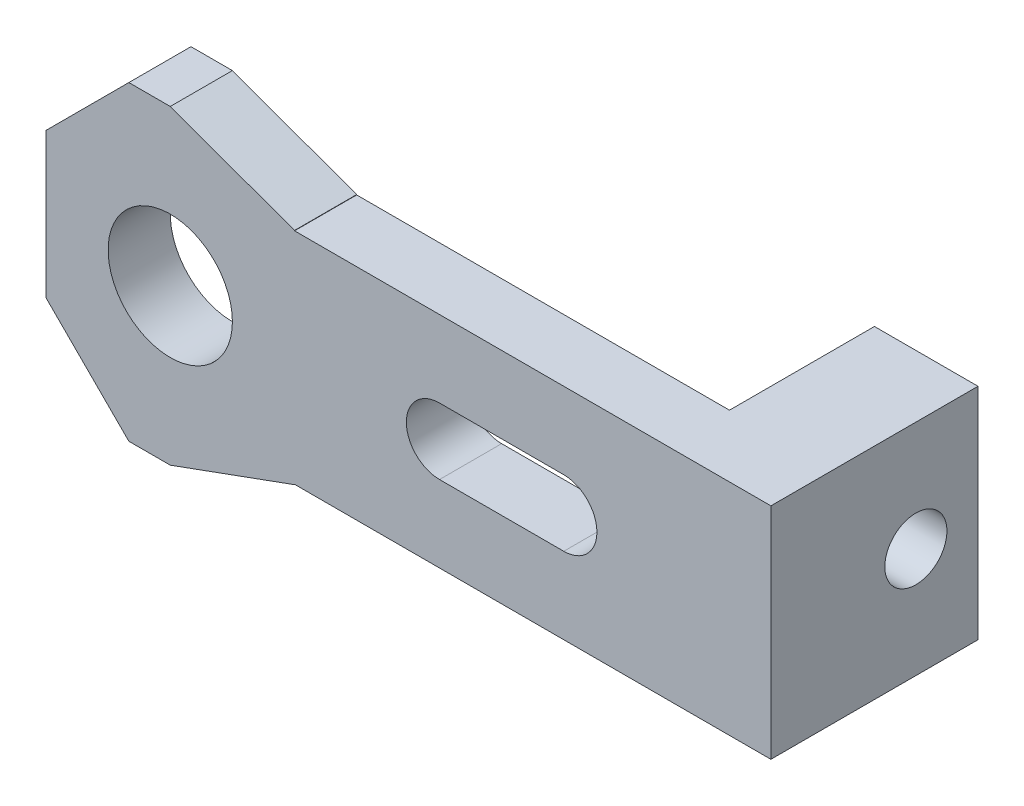
ISO-10303-21;
HEADER;
FILE_DESCRIPTION(('STEP AP214'),'2;1');
FILE_NAME('part.step','',(''),(''),'','','');
FILE_SCHEMA(('AUTOMOTIVE_DESIGN { 1 0 10303 214 1 1 1 1 }'));
ENDSEC;
DATA;
#1=APPLICATION_CONTEXT('core data for automotive mechanical design processes');
#2=APPLICATION_PROTOCOL_DEFINITION('international standard','automotive_design',2000,#1);
#3=PRODUCT_CONTEXT('',#1,'mechanical');
#4=PRODUCT('Part','Part','',(#3));
#5=PRODUCT_RELATED_PRODUCT_CATEGORY('part','',(#4));
#6=PRODUCT_DEFINITION_FORMATION('','',#4);
#7=PRODUCT_DEFINITION_CONTEXT('part definition',#1,'design');
#8=PRODUCT_DEFINITION('design','',#6,#7);
#9=PRODUCT_DEFINITION_SHAPE('','',#8);
#10=(LENGTH_UNIT() NAMED_UNIT(*) SI_UNIT(.MILLI.,.METRE.));
#11=(NAMED_UNIT(*) PLANE_ANGLE_UNIT() SI_UNIT($,.RADIAN.));
#12=(NAMED_UNIT(*) SI_UNIT($,.STERADIAN.) SOLID_ANGLE_UNIT());
#13=UNCERTAINTY_MEASURE_WITH_UNIT(LENGTH_MEASURE(1.E-05),#10,'distance_accuracy_value','');
#14=(GEOMETRIC_REPRESENTATION_CONTEXT(3) GLOBAL_UNCERTAINTY_ASSIGNED_CONTEXT((#13)) GLOBAL_UNIT_ASSIGNED_CONTEXT((#10,
#11,#12)) REPRESENTATION_CONTEXT('',''));
#15=CARTESIAN_POINT('',(0.,0.,0.));
#16=DIRECTION('',(0.,0.,1.));
#17=DIRECTION('',(1.,0.,0.));
#18=AXIS2_PLACEMENT_3D('',#15,#16,#17);
#19=CARTESIAN_POINT('',(0.,0.,3.));
#20=DIRECTION('',(1.,0.,0.));
#21=DIRECTION('',(0.,0.,-1.));
#22=AXIS2_PLACEMENT_3D('',#19,#20,#21);
#23=PLANE('',#22);
#24=DIRECTION('',(0.,-1.,0.));
#25=VECTOR('',#24,1.);
#26=CARTESIAN_POINT('',(0.,0.,0.));
#27=LINE('',#26,#25);
#28=CARTESIAN_POINT('',(0.,11.,0.));
#29=VERTEX_POINT('',#28);
#30=CARTESIAN_POINT('',(0.,4.00000000000002,0.));
#31=VERTEX_POINT('',#30);
#32=EDGE_CURVE('E193',#29,#31,#27,.T.);
#33=ORIENTED_EDGE('',*,*,#32,.T.);
#34=DIRECTION('',(0.,0.,1.));
#35=VECTOR('',#34,1.);
#36=CARTESIAN_POINT('',(0.,4.00000000000002,3.));
#37=LINE('',#36,#35);
#38=CARTESIAN_POINT('',(0.,4.00000000000002,3.));
#39=VERTEX_POINT('',#38);
#40=EDGE_CURVE('E211',#31,#39,#37,.T.);
#41=ORIENTED_EDGE('',*,*,#40,.T.);
#42=DIRECTION('',(0.,-1.,0.));
#43=VECTOR('',#42,1.);
#44=CARTESIAN_POINT('',(0.,0.,3.));
#45=LINE('',#44,#43);
#46=CARTESIAN_POINT('',(0.,11.,3.));
#47=VERTEX_POINT('',#46);
#48=EDGE_CURVE('E189',#47,#39,#45,.T.);
#49=ORIENTED_EDGE('',*,*,#48,.F.);
#50=DIRECTION('',(0.,0.,-1.));
#51=VECTOR('',#50,1.);
#52=CARTESIAN_POINT('',(0.,11.,3.));
#53=LINE('',#52,#51);
#54=EDGE_CURVE('E208',#47,#29,#53,.T.);
#55=ORIENTED_EDGE('',*,*,#54,.T.);
#56=EDGE_LOOP('',(#33,#41,#49,#55));
#57=FACE_BOUND('',#56,.T.);
#58=ADVANCED_FACE('F35',(#57),#23,.F.);
#59=CARTESIAN_POINT('',(0.,0.,3.));
#60=DIRECTION('',(0.,1.,0.));
#61=DIRECTION('',(0.,0.,1.));
#62=AXIS2_PLACEMENT_3D('',#59,#60,#61);
#63=PLANE('',#62);
#64=DIRECTION('',(1.,0.,0.));
#65=VECTOR('',#64,1.);
#66=CARTESIAN_POINT('',(0.,0.,0.));
#67=LINE('',#66,#65);
#68=CARTESIAN_POINT('',(4.,0.,0.));
#69=VERTEX_POINT('',#68);
#70=CARTESIAN_POINT('',(5.99999999999994,0.,0.));
#71=VERTEX_POINT('',#70);
#72=EDGE_CURVE('E196',#69,#71,#67,.T.);
#73=ORIENTED_EDGE('',*,*,#72,.T.);
#74=DIRECTION('',(0.,0.,1.));
#75=VECTOR('',#74,1.);
#76=CARTESIAN_POINT('',(5.99999999999994,0.,3.));
#77=LINE('',#76,#75);
#78=CARTESIAN_POINT('',(5.99999999999994,0.,3.));
#79=VERTEX_POINT('',#78);
#80=EDGE_CURVE('E11',#71,#79,#77,.T.);
#81=ORIENTED_EDGE('',*,*,#80,.T.);
#82=DIRECTION('',(1.,0.,0.));
#83=VECTOR('',#82,1.);
#84=CARTESIAN_POINT('',(0.,0.,3.));
#85=LINE('',#84,#83);
#86=CARTESIAN_POINT('',(4.,0.,3.));
#87=VERTEX_POINT('',#86);
#88=EDGE_CURVE('E185',#87,#79,#85,.T.);
#89=ORIENTED_EDGE('',*,*,#88,.F.);
#90=DIRECTION('',(0.,0.,-1.));
#91=VECTOR('',#90,1.);
#92=CARTESIAN_POINT('',(4.,0.,3.));
#93=LINE('',#92,#91);
#94=EDGE_CURVE('E187',#87,#69,#93,.T.);
#95=ORIENTED_EDGE('',*,*,#94,.T.);
#96=EDGE_LOOP('',(#73,#81,#89,#95));
#97=FACE_BOUND('',#96,.T.);
#98=ADVANCED_FACE('F318',(#97),#63,.F.);
#99=CARTESIAN_POINT('',(35.,0.,3.));
#100=DIRECTION('',(-1.,0.,0.));
#101=DIRECTION('',(0.,0.,1.));
#102=AXIS2_PLACEMENT_3D('',#99,#100,#101);
#103=PLANE('',#102);
#104=CARTESIAN_POINT('',(35.,7.5,-4.));
#105=DIRECTION('',(-1.,0.,0.));
#106=DIRECTION('',(0.,0.,1.));
#107=AXIS2_PLACEMENT_3D('',#104,#105,#106);
#108=CIRCLE('',#107,1.5);
#109=CARTESIAN_POINT('',(35.,7.5,-2.5));
#110=VERTEX_POINT('',#109);
#111=EDGE_CURVE('E338',#110,#110,#108,.T.);
#112=ORIENTED_EDGE('',*,*,#111,.T.);
#113=EDGE_LOOP('',(#112));
#114=FACE_BOUND('',#113,.T.);
#115=DIRECTION('',(0.,-1.,0.));
#116=VECTOR('',#115,1.);
#117=CARTESIAN_POINT('',(35.,0.,-7.));
#118=LINE('',#117,#116);
#119=CARTESIAN_POINT('',(35.,12.8,-7.));
#120=VERTEX_POINT('',#119);
#121=CARTESIAN_POINT('',(35.,2.2,-7.));
#122=VERTEX_POINT('',#121);
#123=EDGE_CURVE('E178',#120,#122,#118,.T.);
#124=ORIENTED_EDGE('',*,*,#123,.F.);
#125=DIRECTION('',(0.,0.,-1.));
#126=VECTOR('',#125,1.);
#127=CARTESIAN_POINT('',(35.,12.8,3.));
#128=LINE('',#127,#126);
#129=CARTESIAN_POINT('',(35.,12.8,3.));
#130=VERTEX_POINT('',#129);
#131=EDGE_CURVE('E162',#130,#120,#128,.T.);
#132=ORIENTED_EDGE('',*,*,#131,.F.);
#133=DIRECTION('',(0.,1.,0.));
#134=VECTOR('',#133,1.);
#135=CARTESIAN_POINT('',(35.,0.,3.));
#136=LINE('',#135,#134);
#137=CARTESIAN_POINT('',(35.,2.2,3.));
#138=VERTEX_POINT('',#137);
#139=EDGE_CURVE('E177',#138,#130,#136,.T.);
#140=ORIENTED_EDGE('',*,*,#139,.F.);
#141=DIRECTION('',(0.,0.,-1.));
#142=VECTOR('',#141,1.);
#143=CARTESIAN_POINT('',(35.,2.2,3.));
#144=LINE('',#143,#142);
#145=EDGE_CURVE('E264',#138,#122,#144,.T.);
#146=ORIENTED_EDGE('',*,*,#145,.T.);
#147=EDGE_LOOP('',(#124,#132,#140,#146));
#148=FACE_BOUND('',#147,.T.);
#149=ADVANCED_FACE('F175',(#114,#148),#103,.F.);
#150=CARTESIAN_POINT('',(0.,15.,3.));
#151=DIRECTION('',(0.,-1.,0.));
#152=DIRECTION('',(0.,0.,-1.));
#153=AXIS2_PLACEMENT_3D('',#150,#151,#152);
#154=PLANE('',#153);
#155=DIRECTION('',(-1.,0.,0.));
#156=VECTOR('',#155,1.);
#157=CARTESIAN_POINT('',(0.,15.,3.));
#158=LINE('',#157,#156);
#159=CARTESIAN_POINT('',(5.99999999999995,15.,3.));
#160=VERTEX_POINT('',#159);
#161=CARTESIAN_POINT('',(4.00000000000002,15.,3.));
#162=VERTEX_POINT('',#161);
#163=EDGE_CURVE('E184',#160,#162,#158,.T.);
#164=ORIENTED_EDGE('',*,*,#163,.F.);
#165=DIRECTION('',(0.,0.,-1.));
#166=VECTOR('',#165,1.);
#167=CARTESIAN_POINT('',(5.99999999999995,15.,3.));
#168=LINE('',#167,#166);
#169=CARTESIAN_POINT('',(5.99999999999995,15.,0.));
#170=VERTEX_POINT('',#169);
#171=EDGE_CURVE('E228',#160,#170,#168,.T.);
#172=ORIENTED_EDGE('',*,*,#171,.T.);
#173=DIRECTION('',(-1.,0.,0.));
#174=VECTOR('',#173,1.);
#175=CARTESIAN_POINT('',(0.,15.,0.));
#176=LINE('',#175,#174);
#177=CARTESIAN_POINT('',(4.00000000000002,15.,0.));
#178=VERTEX_POINT('',#177);
#179=EDGE_CURVE('E199',#170,#178,#176,.T.);
#180=ORIENTED_EDGE('',*,*,#179,.T.);
#181=DIRECTION('',(0.,0.,1.));
#182=VECTOR('',#181,1.);
#183=CARTESIAN_POINT('',(4.00000000000002,15.,3.));
#184=LINE('',#183,#182);
#185=EDGE_CURVE('E217',#178,#162,#184,.T.);
#186=ORIENTED_EDGE('',*,*,#185,.T.);
#187=EDGE_LOOP('',(#164,#172,#180,#186));
#188=FACE_BOUND('',#187,.T.);
#189=ADVANCED_FACE('F326',(#188),#154,.F.);
#190=CARTESIAN_POINT('',(0.,0.,3.));
#191=DIRECTION('',(0.,0.,-1.));
#192=DIRECTION('',(-1.,0.,0.));
#193=AXIS2_PLACEMENT_3D('',#190,#191,#192);
#194=PLANE('',#193);
#195=DIRECTION('',(-1.,0.,0.));
#196=VECTOR('',#195,1.);
#197=CARTESIAN_POINT('',(19.,5.9,3.));
#198=LINE('',#197,#196);
#199=CARTESIAN_POINT('',(25.,5.9,3.));
#200=VERTEX_POINT('',#199);
#201=CARTESIAN_POINT('',(19.,5.9,3.));
#202=VERTEX_POINT('',#201);
#203=EDGE_CURVE('E283',#200,#202,#198,.T.);
#204=ORIENTED_EDGE('',*,*,#203,.T.);
#205=CARTESIAN_POINT('',(19.,7.5,3.));
#206=DIRECTION('',(0.,0.,-1.));
#207=DIRECTION('',(-1.,0.,0.));
#208=AXIS2_PLACEMENT_3D('',#205,#206,#207);
#209=CIRCLE('',#208,1.6);
#210=CARTESIAN_POINT('',(19.,9.1,3.));
#211=VERTEX_POINT('',#210);
#212=EDGE_CURVE('E273',#202,#211,#209,.T.);
#213=ORIENTED_EDGE('',*,*,#212,.T.);
#214=DIRECTION('',(1.,0.,0.));
#215=VECTOR('',#214,1.);
#216=CARTESIAN_POINT('',(19.,9.1,3.));
#217=LINE('',#216,#215);
#218=CARTESIAN_POINT('',(25.,9.1,3.));
#219=VERTEX_POINT('',#218);
#220=EDGE_CURVE('E276',#211,#219,#217,.T.);
#221=ORIENTED_EDGE('',*,*,#220,.T.);
#222=CARTESIAN_POINT('',(25.,7.5,3.));
#223=DIRECTION('',(0.,0.,-1.));
#224=DIRECTION('',(-1.,0.,0.));
#225=AXIS2_PLACEMENT_3D('',#222,#223,#224);
#226=CIRCLE('',#225,1.6);
#227=EDGE_CURVE('E280',#219,#200,#226,.T.);
#228=ORIENTED_EDGE('',*,*,#227,.T.);
#229=EDGE_LOOP('',(#204,#213,#221,#228));
#230=FACE_BOUND('',#229,.T.);
#231=CARTESIAN_POINT('',(6.,7.5,3.));
#232=DIRECTION('',(0.,0.,1.));
#233=DIRECTION('',(1.,0.,0.));
#234=AXIS2_PLACEMENT_3D('',#231,#232,#233);
#235=CIRCLE('',#234,3.);
#236=CARTESIAN_POINT('',(9.,7.5,3.));
#237=VERTEX_POINT('',#236);
#238=EDGE_CURVE('E298',#237,#237,#235,.T.);
#239=ORIENTED_EDGE('',*,*,#238,.F.);
#240=EDGE_LOOP('',(#239));
#241=FACE_BOUND('',#240,.T.);
#242=DIRECTION('',(0.,1.,0.));
#243=VECTOR('',#242,1.);
#244=CARTESIAN_POINT('',(12.,15.,3.));
#245=LINE('',#244,#243);
#246=CARTESIAN_POINT('',(12.,12.8,3.));
#247=VERTEX_POINT('',#246);
#248=CARTESIAN_POINT('',(12.,12.8161785944028,3.));
#249=VERTEX_POINT('',#248);
#250=EDGE_CURVE('E169',#247,#249,#245,.T.);
#251=ORIENTED_EDGE('',*,*,#250,.T.);
#252=DIRECTION('',(0.939692620785909,-0.342020143325666,0.));
#253=VECTOR('',#252,1.);
#254=CARTESIAN_POINT('',(5.99999999999995,15.,3.));
#255=LINE('',#254,#253);
#256=EDGE_CURVE('E238',#249,#160,#255,.F.);
#257=ORIENTED_EDGE('',*,*,#256,.T.);
#258=ORIENTED_EDGE('',*,*,#163,.T.);
#259=DIRECTION('',(0.707106781186549,0.707106781186546,0.));
#260=VECTOR('',#259,1.);
#261=CARTESIAN_POINT('',(0.,11.,3.));
#262=LINE('',#261,#260);
#263=EDGE_CURVE('E213',#162,#47,#262,.F.);
#264=ORIENTED_EDGE('',*,*,#263,.T.);
#265=ORIENTED_EDGE('',*,*,#48,.T.);
#266=DIRECTION('',(-0.707106781186546,0.707106781186549,0.));
#267=VECTOR('',#266,1.);
#268=CARTESIAN_POINT('',(4.,0.,3.));
#269=LINE('',#268,#267);
#270=EDGE_CURVE('E215',#39,#87,#269,.F.);
#271=ORIENTED_EDGE('',*,*,#270,.T.);
#272=ORIENTED_EDGE('',*,*,#88,.T.);
#273=DIRECTION('',(-0.939692620785909,-0.342020143325666,0.));
#274=VECTOR('',#273,1.);
#275=CARTESIAN_POINT('',(12.,2.18382140559722,3.));
#276=LINE('',#275,#274);
#277=CARTESIAN_POINT('',(12.,2.18382140559722,3.));
#278=VERTEX_POINT('',#277);
#279=EDGE_CURVE('E50',#79,#278,#276,.F.);
#280=ORIENTED_EDGE('',*,*,#279,.T.);
#281=DIRECTION('',(0.,1.,0.));
#282=VECTOR('',#281,1.);
#283=CARTESIAN_POINT('',(12.,0.,3.));
#284=LINE('',#283,#282);
#285=CARTESIAN_POINT('',(12.,2.2,3.));
#286=VERTEX_POINT('',#285);
#287=EDGE_CURVE('E246',#278,#286,#284,.T.);
#288=ORIENTED_EDGE('',*,*,#287,.T.);
#289=DIRECTION('',(1.,0.,0.));
#290=VECTOR('',#289,1.);
#291=CARTESIAN_POINT('',(35.,2.2,3.));
#292=LINE('',#291,#290);
#293=EDGE_CURVE('E183',#286,#138,#292,.T.);
#294=ORIENTED_EDGE('',*,*,#293,.T.);
#295=ORIENTED_EDGE('',*,*,#139,.T.);
#296=DIRECTION('',(-1.,0.,0.));
#297=VECTOR('',#296,1.);
#298=CARTESIAN_POINT('',(35.,12.8,3.));
#299=LINE('',#298,#297);
#300=EDGE_CURVE('E159',#130,#247,#299,.T.);
#301=ORIENTED_EDGE('',*,*,#300,.T.);
#302=EDGE_LOOP('',(#251,#257,#258,#264,#265,#271,#272,#280,#288,#294,#295,#301));
#303=FACE_BOUND('',#302,.T.);
#304=ADVANCED_FACE('F181',(#230,#241,#303),#194,.F.);
#305=CARTESIAN_POINT('',(0.,0.,0.));
#306=DIRECTION('',(0.,0.,-1.));
#307=DIRECTION('',(-1.,0.,0.));
#308=AXIS2_PLACEMENT_3D('',#305,#306,#307);
#309=PLANE('',#308);
#310=ORIENTED_EDGE('',*,*,#179,.F.);
#311=DIRECTION('',(-0.939692620785909,0.342020143325666,0.));
#312=VECTOR('',#311,1.);
#313=CARTESIAN_POINT('',(5.52277374329207,15.173696152452,0.));
#314=LINE('',#313,#312);
#315=CARTESIAN_POINT('',(12.,12.8161785944028,0.));
#316=VERTEX_POINT('',#315);
#317=EDGE_CURVE('E233',#170,#316,#314,.F.);
#318=ORIENTED_EDGE('',*,*,#317,.T.);
#319=DIRECTION('',(0.,1.,0.));
#320=VECTOR('',#319,1.);
#321=CARTESIAN_POINT('',(12.,0.,0.));
#322=LINE('',#321,#320);
#323=CARTESIAN_POINT('',(12.,12.8,0.));
#324=VERTEX_POINT('',#323);
#325=EDGE_CURVE('E225',#324,#316,#322,.T.);
#326=ORIENTED_EDGE('',*,*,#325,.F.);
#327=DIRECTION('',(-1.,0.,0.));
#328=VECTOR('',#327,1.);
#329=CARTESIAN_POINT('',(0.,12.8,0.));
#330=LINE('',#329,#328);
#331=CARTESIAN_POINT('',(30.,12.8,0.));
#332=VERTEX_POINT('',#331);
#333=EDGE_CURVE('E343',#332,#324,#330,.T.);
#334=ORIENTED_EDGE('',*,*,#333,.F.);
#335=DIRECTION('',(0.,1.,0.));
#336=VECTOR('',#335,1.);
#337=CARTESIAN_POINT('',(30.,0.,0.));
#338=LINE('',#337,#336);
#339=CARTESIAN_POINT('',(30.,2.2,0.));
#340=VERTEX_POINT('',#339);
#341=EDGE_CURVE('E258',#340,#332,#338,.T.);
#342=ORIENTED_EDGE('',*,*,#341,.F.);
#343=DIRECTION('',(1.,0.,0.));
#344=VECTOR('',#343,1.);
#345=CARTESIAN_POINT('',(0.,2.2,0.));
#346=LINE('',#345,#344);
#347=CARTESIAN_POINT('',(12.,2.2,0.));
#348=VERTEX_POINT('',#347);
#349=EDGE_CURVE('E255',#348,#340,#346,.T.);
#350=ORIENTED_EDGE('',*,*,#349,.F.);
#351=DIRECTION('',(0.,1.,0.));
#352=VECTOR('',#351,1.);
#353=CARTESIAN_POINT('',(12.,0.,0.));
#354=LINE('',#353,#352);
#355=CARTESIAN_POINT('',(12.,2.18382140559722,0.));
#356=VERTEX_POINT('',#355);
#357=EDGE_CURVE('E223',#356,#348,#354,.T.);
#358=ORIENTED_EDGE('',*,*,#357,.F.);
#359=DIRECTION('',(0.939692620785909,0.342020143325666,0.));
#360=VECTOR('',#359,1.);
#361=CARTESIAN_POINT('',(0.70186667064305,-1.92836282905959,0.));
#362=LINE('',#361,#360);
#363=EDGE_CURVE('E231',#356,#71,#362,.F.);
#364=ORIENTED_EDGE('',*,*,#363,.T.);
#365=ORIENTED_EDGE('',*,*,#72,.F.);
#366=DIRECTION('',(0.707106781186546,-0.707106781186549,0.));
#367=VECTOR('',#366,1.);
#368=CARTESIAN_POINT('',(2.00000000000001,2.,0.));
#369=LINE('',#368,#367);
#370=EDGE_CURVE('E206',#69,#31,#369,.F.);
#371=ORIENTED_EDGE('',*,*,#370,.T.);
#372=ORIENTED_EDGE('',*,*,#32,.F.);
#373=DIRECTION('',(-0.707106781186549,-0.707106781186546,0.));
#374=VECTOR('',#373,1.);
#375=CARTESIAN_POINT('',(-5.5,5.50000000000002,0.));
#376=LINE('',#375,#374);
#377=EDGE_CURVE('E203',#29,#178,#376,.F.);
#378=ORIENTED_EDGE('',*,*,#377,.T.);
#379=EDGE_LOOP('',(#310,#318,#326,#334,#342,#350,#358,#364,#365,#371,#372,#378));
#380=FACE_BOUND('',#379,.T.);
#381=CARTESIAN_POINT('',(19.,7.5,0.));
#382=DIRECTION('',(0.,0.,-1.));
#383=DIRECTION('',(-1.,0.,0.));
#384=AXIS2_PLACEMENT_3D('',#381,#382,#383);
#385=CIRCLE('',#384,1.6);
#386=CARTESIAN_POINT('',(19.,5.9,0.));
#387=VERTEX_POINT('',#386);
#388=CARTESIAN_POINT('',(19.,9.1,0.));
#389=VERTEX_POINT('',#388);
#390=EDGE_CURVE('E271',#387,#389,#385,.T.);
#391=ORIENTED_EDGE('',*,*,#390,.F.);
#392=DIRECTION('',(-1.,0.,0.));
#393=VECTOR('',#392,1.);
#394=CARTESIAN_POINT('',(19.,5.9,0.));
#395=LINE('',#394,#393);
#396=CARTESIAN_POINT('',(25.,5.9,0.));
#397=VERTEX_POINT('',#396);
#398=EDGE_CURVE('E277',#397,#387,#395,.T.);
#399=ORIENTED_EDGE('',*,*,#398,.F.);
#400=CARTESIAN_POINT('',(25.,7.5,0.));
#401=DIRECTION('',(0.,0.,-1.));
#402=DIRECTION('',(-1.,0.,0.));
#403=AXIS2_PLACEMENT_3D('',#400,#401,#402);
#404=CIRCLE('',#403,1.6);
#405=CARTESIAN_POINT('',(25.,9.1,0.));
#406=VERTEX_POINT('',#405);
#407=EDGE_CURVE('E291',#406,#397,#404,.T.);
#408=ORIENTED_EDGE('',*,*,#407,.F.);
#409=DIRECTION('',(1.,0.,0.));
#410=VECTOR('',#409,1.);
#411=CARTESIAN_POINT('',(19.,9.1,0.));
#412=LINE('',#411,#410);
#413=EDGE_CURVE('E288',#389,#406,#412,.T.);
#414=ORIENTED_EDGE('',*,*,#413,.F.);
#415=EDGE_LOOP('',(#391,#399,#408,#414));
#416=FACE_BOUND('',#415,.T.);
#417=CARTESIAN_POINT('',(6.,7.5,0.));
#418=DIRECTION('',(0.,0.,1.));
#419=DIRECTION('',(1.,0.,0.));
#420=AXIS2_PLACEMENT_3D('',#417,#418,#419);
#421=CIRCLE('',#420,3.);
#422=CARTESIAN_POINT('',(9.,7.5,0.));
#423=VERTEX_POINT('',#422);
#424=EDGE_CURVE('E197',#423,#423,#421,.T.);
#425=ORIENTED_EDGE('',*,*,#424,.T.);
#426=EDGE_LOOP('',(#425));
#427=FACE_BOUND('',#426,.T.);
#428=ADVANCED_FACE('F251',(#380,#416,#427),#309,.T.);
#429=CARTESIAN_POINT('',(6.,7.5,0.));
#430=DIRECTION('',(0.,0.,1.));
#431=DIRECTION('',(1.,0.,0.));
#432=AXIS2_PLACEMENT_3D('',#429,#430,#431);
#433=CYLINDRICAL_SURFACE('',#432,3.);
#434=ORIENTED_EDGE('',*,*,#424,.F.);
#435=EDGE_LOOP('',(#434));
#436=FACE_BOUND('',#435,.T.);
#437=ORIENTED_EDGE('',*,*,#238,.T.);
#438=EDGE_LOOP('',(#437));
#439=FACE_BOUND('',#438,.T.);
#440=ADVANCED_FACE('F379',(#436,#439),#433,.F.);
#441=CARTESIAN_POINT('',(4.,0.,3.));
#442=DIRECTION('',(0.707106781186549,0.707106781186546,0.));
#443=DIRECTION('',(0.,0.,-1.));
#444=AXIS2_PLACEMENT_3D('',#441,#442,#443);
#445=PLANE('',#444);
#446=ORIENTED_EDGE('',*,*,#270,.F.);
#447=ORIENTED_EDGE('',*,*,#40,.F.);
#448=ORIENTED_EDGE('',*,*,#370,.F.);
#449=ORIENTED_EDGE('',*,*,#94,.F.);
#450=EDGE_LOOP('',(#446,#447,#448,#449));
#451=FACE_BOUND('',#450,.T.);
#452=ADVANCED_FACE('F317',(#451),#445,.F.);
#453=CARTESIAN_POINT('',(0.,11.,3.));
#454=DIRECTION('',(0.707106781186546,-0.707106781186549,0.));
#455=DIRECTION('',(0.,0.,-1.));
#456=AXIS2_PLACEMENT_3D('',#453,#454,#455);
#457=PLANE('',#456);
#458=ORIENTED_EDGE('',*,*,#263,.F.);
#459=ORIENTED_EDGE('',*,*,#185,.F.);
#460=ORIENTED_EDGE('',*,*,#377,.F.);
#461=ORIENTED_EDGE('',*,*,#54,.F.);
#462=EDGE_LOOP('',(#458,#459,#460,#461));
#463=FACE_BOUND('',#462,.T.);
#464=ADVANCED_FACE('F321',(#463),#457,.F.);
#465=CARTESIAN_POINT('',(19.,7.5,3.));
#466=DIRECTION('',(0.,0.,-1.));
#467=DIRECTION('',(-1.,0.,0.));
#468=AXIS2_PLACEMENT_3D('',#465,#466,#467);
#469=CYLINDRICAL_SURFACE('',#468,1.6);
#470=ORIENTED_EDGE('',*,*,#390,.T.);
#471=DIRECTION('',(0.,0.,-1.));
#472=VECTOR('',#471,1.);
#473=CARTESIAN_POINT('',(19.,9.1,3.));
#474=LINE('',#473,#472);
#475=EDGE_CURVE('E286',#211,#389,#474,.T.);
#476=ORIENTED_EDGE('',*,*,#475,.F.);
#477=ORIENTED_EDGE('',*,*,#212,.F.);
#478=DIRECTION('',(0.,0.,-1.));
#479=VECTOR('',#478,1.);
#480=CARTESIAN_POINT('',(19.,5.9,3.));
#481=LINE('',#480,#479);
#482=EDGE_CURVE('E296',#202,#387,#481,.T.);
#483=ORIENTED_EDGE('',*,*,#482,.T.);
#484=EDGE_LOOP('',(#470,#476,#477,#483));
#485=FACE_BOUND('',#484,.T.);
#486=ADVANCED_FACE('F381',(#485),#469,.F.);
#487=CARTESIAN_POINT('',(19.,5.9,3.));
#488=DIRECTION('',(0.,-1.,0.));
#489=DIRECTION('',(0.,0.,-1.));
#490=AXIS2_PLACEMENT_3D('',#487,#488,#489);
#491=PLANE('',#490);
#492=ORIENTED_EDGE('',*,*,#398,.T.);
#493=ORIENTED_EDGE('',*,*,#482,.F.);
#494=ORIENTED_EDGE('',*,*,#203,.F.);
#495=DIRECTION('',(0.,0.,-1.));
#496=VECTOR('',#495,1.);
#497=CARTESIAN_POINT('',(25.,5.9,3.));
#498=LINE('',#497,#496);
#499=EDGE_CURVE('E299',#200,#397,#498,.T.);
#500=ORIENTED_EDGE('',*,*,#499,.T.);
#501=EDGE_LOOP('',(#492,#493,#494,#500));
#502=FACE_BOUND('',#501,.T.);
#503=ADVANCED_FACE('F516',(#502),#491,.F.);
#504=CARTESIAN_POINT('',(25.,7.5,3.));
#505=DIRECTION('',(0.,0.,-1.));
#506=DIRECTION('',(-1.,0.,0.));
#507=AXIS2_PLACEMENT_3D('',#504,#505,#506);
#508=CYLINDRICAL_SURFACE('',#507,1.6);
#509=ORIENTED_EDGE('',*,*,#407,.T.);
#510=ORIENTED_EDGE('',*,*,#499,.F.);
#511=ORIENTED_EDGE('',*,*,#227,.F.);
#512=DIRECTION('',(0.,0.,-1.));
#513=VECTOR('',#512,1.);
#514=CARTESIAN_POINT('',(25.,9.1,3.));
#515=LINE('',#514,#513);
#516=EDGE_CURVE('E301',#219,#406,#515,.T.);
#517=ORIENTED_EDGE('',*,*,#516,.T.);
#518=EDGE_LOOP('',(#509,#510,#511,#517));
#519=FACE_BOUND('',#518,.T.);
#520=ADVANCED_FACE('F364',(#519),#508,.F.);
#521=CARTESIAN_POINT('',(19.,9.1,3.));
#522=DIRECTION('',(0.,1.,0.));
#523=DIRECTION('',(-1.,0.,0.));
#524=AXIS2_PLACEMENT_3D('',#521,#522,#523);
#525=PLANE('',#524);
#526=ORIENTED_EDGE('',*,*,#413,.T.);
#527=ORIENTED_EDGE('',*,*,#516,.F.);
#528=ORIENTED_EDGE('',*,*,#220,.F.);
#529=ORIENTED_EDGE('',*,*,#475,.T.);
#530=EDGE_LOOP('',(#526,#527,#528,#529));
#531=FACE_BOUND('',#530,.T.);
#532=ADVANCED_FACE('F356',(#531),#525,.F.);
#533=CARTESIAN_POINT('',(30.,0.,-7.));
#534=DIRECTION('',(1.,0.,0.));
#535=DIRECTION('',(0.,0.,-1.));
#536=AXIS2_PLACEMENT_3D('',#533,#534,#535);
#537=PLANE('',#536);
#538=CARTESIAN_POINT('',(30.,7.5,-4.));
#539=DIRECTION('',(-1.,0.,0.));
#540=DIRECTION('',(0.,0.,1.));
#541=AXIS2_PLACEMENT_3D('',#538,#539,#540);
#542=CIRCLE('',#541,1.5);
#543=CARTESIAN_POINT('',(30.,7.5,-2.5));
#544=VERTEX_POINT('',#543);
#545=EDGE_CURVE('E449',#544,#544,#542,.T.);
#546=ORIENTED_EDGE('',*,*,#545,.F.);
#547=EDGE_LOOP('',(#546));
#548=FACE_BOUND('',#547,.T.);
#549=ORIENTED_EDGE('',*,*,#341,.T.);
#550=DIRECTION('',(0.,0.,-1.));
#551=VECTOR('',#550,1.);
#552=CARTESIAN_POINT('',(30.,12.8,-7.));
#553=LINE('',#552,#551);
#554=CARTESIAN_POINT('',(30.,12.8,-7.));
#555=VERTEX_POINT('',#554);
#556=EDGE_CURVE('E339',#332,#555,#553,.T.);
#557=ORIENTED_EDGE('',*,*,#556,.T.);
#558=DIRECTION('',(0.,1.,0.));
#559=VECTOR('',#558,1.);
#560=CARTESIAN_POINT('',(30.,0.,-7.));
#561=LINE('',#560,#559);
#562=CARTESIAN_POINT('',(30.,2.2,-7.));
#563=VERTEX_POINT('',#562);
#564=EDGE_CURVE('E269',#563,#555,#561,.T.);
#565=ORIENTED_EDGE('',*,*,#564,.F.);
#566=DIRECTION('',(0.,0.,1.));
#567=VECTOR('',#566,1.);
#568=CARTESIAN_POINT('',(30.,2.2,-7.));
#569=LINE('',#568,#567);
#570=EDGE_CURVE('E261',#563,#340,#569,.T.);
#571=ORIENTED_EDGE('',*,*,#570,.T.);
#572=EDGE_LOOP('',(#549,#557,#565,#571));
#573=FACE_BOUND('',#572,.T.);
#574=ADVANCED_FACE('F354',(#548,#573),#537,.F.);
#575=CARTESIAN_POINT('',(0.,0.,-7.));
#576=DIRECTION('',(0.,0.,1.));
#577=DIRECTION('',(1.,0.,0.));
#578=AXIS2_PLACEMENT_3D('',#575,#576,#577);
#579=PLANE('',#578);
#580=ORIENTED_EDGE('',*,*,#564,.T.);
#581=DIRECTION('',(-1.,0.,0.));
#582=VECTOR('',#581,1.);
#583=CARTESIAN_POINT('',(35.,12.8,-7.));
#584=LINE('',#583,#582);
#585=EDGE_CURVE('E170',#120,#555,#584,.T.);
#586=ORIENTED_EDGE('',*,*,#585,.F.);
#587=ORIENTED_EDGE('',*,*,#123,.T.);
#588=DIRECTION('',(-1.,0.,0.));
#589=VECTOR('',#588,1.);
#590=CARTESIAN_POINT('',(0.,2.2,-7.));
#591=LINE('',#590,#589);
#592=EDGE_CURVE('E220',#122,#563,#591,.T.);
#593=ORIENTED_EDGE('',*,*,#592,.T.);
#594=EDGE_LOOP('',(#580,#586,#587,#593));
#595=FACE_BOUND('',#594,.T.);
#596=ADVANCED_FACE('F352',(#595),#579,.F.);
#597=CARTESIAN_POINT('',(35.,2.2,3.));
#598=DIRECTION('',(0.,1.,0.));
#599=DIRECTION('',(0.,0.,1.));
#600=AXIS2_PLACEMENT_3D('',#597,#598,#599);
#601=PLANE('',#600);
#602=ORIENTED_EDGE('',*,*,#349,.T.);
#603=ORIENTED_EDGE('',*,*,#570,.F.);
#604=ORIENTED_EDGE('',*,*,#592,.F.);
#605=ORIENTED_EDGE('',*,*,#145,.F.);
#606=ORIENTED_EDGE('',*,*,#293,.F.);
#607=DIRECTION('',(0.,0.,-1.));
#608=VECTOR('',#607,1.);
#609=CARTESIAN_POINT('',(12.,2.2,3.));
#610=LINE('',#609,#608);
#611=EDGE_CURVE('E347',#286,#348,#610,.T.);
#612=ORIENTED_EDGE('',*,*,#611,.T.);
#613=EDGE_LOOP('',(#602,#603,#604,#605,#606,#612));
#614=FACE_BOUND('',#613,.T.);
#615=ADVANCED_FACE('F348',(#614),#601,.F.);
#616=CARTESIAN_POINT('',(12.,0.,3.));
#617=DIRECTION('',(-1.,0.,0.));
#618=DIRECTION('',(0.,0.,1.));
#619=AXIS2_PLACEMENT_3D('',#616,#617,#618);
#620=PLANE('',#619);
#621=ORIENTED_EDGE('',*,*,#287,.F.);
#622=DIRECTION('',(0.,0.,-1.));
#623=VECTOR('',#622,1.);
#624=CARTESIAN_POINT('',(12.,2.18382140559722,3.));
#625=LINE('',#624,#623);
#626=EDGE_CURVE('E43',#278,#356,#625,.T.);
#627=ORIENTED_EDGE('',*,*,#626,.T.);
#628=ORIENTED_EDGE('',*,*,#357,.T.);
#629=ORIENTED_EDGE('',*,*,#611,.F.);
#630=EDGE_LOOP('',(#621,#627,#628,#629));
#631=FACE_BOUND('',#630,.T.);
#632=ADVANCED_FACE('F243',(#631),#620,.F.);
#633=CARTESIAN_POINT('',(12.,15.,3.));
#634=DIRECTION('',(-1.,0.,0.));
#635=DIRECTION('',(0.,0.,1.));
#636=AXIS2_PLACEMENT_3D('',#633,#634,#635);
#637=PLANE('',#636);
#638=ORIENTED_EDGE('',*,*,#325,.T.);
#639=DIRECTION('',(0.,0.,1.));
#640=VECTOR('',#639,1.);
#641=CARTESIAN_POINT('',(12.,12.8161785944028,3.));
#642=LINE('',#641,#640);
#643=EDGE_CURVE('E235',#316,#249,#642,.T.);
#644=ORIENTED_EDGE('',*,*,#643,.T.);
#645=ORIENTED_EDGE('',*,*,#250,.F.);
#646=DIRECTION('',(0.,0.,-1.));
#647=VECTOR('',#646,1.);
#648=CARTESIAN_POINT('',(12.,12.8,3.));
#649=LINE('',#648,#647);
#650=EDGE_CURVE('E165',#247,#324,#649,.T.);
#651=ORIENTED_EDGE('',*,*,#650,.T.);
#652=EDGE_LOOP('',(#638,#644,#645,#651));
#653=FACE_BOUND('',#652,.T.);
#654=ADVANCED_FACE('F333',(#653),#637,.F.);
#655=CARTESIAN_POINT('',(35.,12.8,3.));
#656=DIRECTION('',(0.,-1.,0.));
#657=DIRECTION('',(1.,0.,0.));
#658=AXIS2_PLACEMENT_3D('',#655,#656,#657);
#659=PLANE('',#658);
#660=ORIENTED_EDGE('',*,*,#333,.T.);
#661=ORIENTED_EDGE('',*,*,#650,.F.);
#662=ORIENTED_EDGE('',*,*,#300,.F.);
#663=ORIENTED_EDGE('',*,*,#131,.T.);
#664=ORIENTED_EDGE('',*,*,#585,.T.);
#665=ORIENTED_EDGE('',*,*,#556,.F.);
#666=EDGE_LOOP('',(#660,#661,#662,#663,#664,#665));
#667=FACE_BOUND('',#666,.T.);
#668=ADVANCED_FACE('F161',(#667),#659,.F.);
#669=CARTESIAN_POINT('',(5.99999999999995,15.,3.));
#670=DIRECTION('',(-0.342020143325666,-0.939692620785909,0.));
#671=DIRECTION('',(0.,0.,-1.));
#672=AXIS2_PLACEMENT_3D('',#669,#670,#671);
#673=PLANE('',#672);
#674=ORIENTED_EDGE('',*,*,#256,.F.);
#675=ORIENTED_EDGE('',*,*,#643,.F.);
#676=ORIENTED_EDGE('',*,*,#317,.F.);
#677=ORIENTED_EDGE('',*,*,#171,.F.);
#678=EDGE_LOOP('',(#674,#675,#676,#677));
#679=FACE_BOUND('',#678,.T.);
#680=ADVANCED_FACE('F330',(#679),#673,.F.);
#681=CARTESIAN_POINT('',(12.,2.18382140559722,3.));
#682=DIRECTION('',(-0.342020143325666,0.939692620785909,0.));
#683=DIRECTION('',(0.,0.,-1.));
#684=AXIS2_PLACEMENT_3D('',#681,#682,#683);
#685=PLANE('',#684);
#686=ORIENTED_EDGE('',*,*,#279,.F.);
#687=ORIENTED_EDGE('',*,*,#80,.F.);
#688=ORIENTED_EDGE('',*,*,#363,.F.);
#689=ORIENTED_EDGE('',*,*,#626,.F.);
#690=EDGE_LOOP('',(#686,#687,#688,#689));
#691=FACE_BOUND('',#690,.T.);
#692=ADVANCED_FACE('F37',(#691),#685,.F.);
#693=CARTESIAN_POINT('',(37.,7.5,-4.));
#694=DIRECTION('',(-1.,0.,0.));
#695=DIRECTION('',(0.,0.,1.));
#696=AXIS2_PLACEMENT_3D('',#693,#694,#695);
#697=CYLINDRICAL_SURFACE('',#696,1.5);
#698=ORIENTED_EDGE('',*,*,#545,.T.);
#699=EDGE_LOOP('',(#698));
#700=FACE_BOUND('',#699,.T.);
#701=ORIENTED_EDGE('',*,*,#111,.F.);
#702=EDGE_LOOP('',(#701));
#703=FACE_BOUND('',#702,.T.);
#704=ADVANCED_FACE('F387',(#700,#703),#697,.F.);
#705=CLOSED_SHELL('',(#58,#98,#149,#189,#304,#428,#440,#452,#464,#486,#503,#520,#532,#574,#596,
#615,#632,#654,#668,#680,#692,#704));
#706=MANIFOLD_SOLID_BREP('B2',#705);
#707=ADVANCED_BREP_SHAPE_REPRESENTATION('',(#18,#706),#14);
#708=SHAPE_DEFINITION_REPRESENTATION(#9,#707);
ENDSEC;
END-ISO-10303-21;
